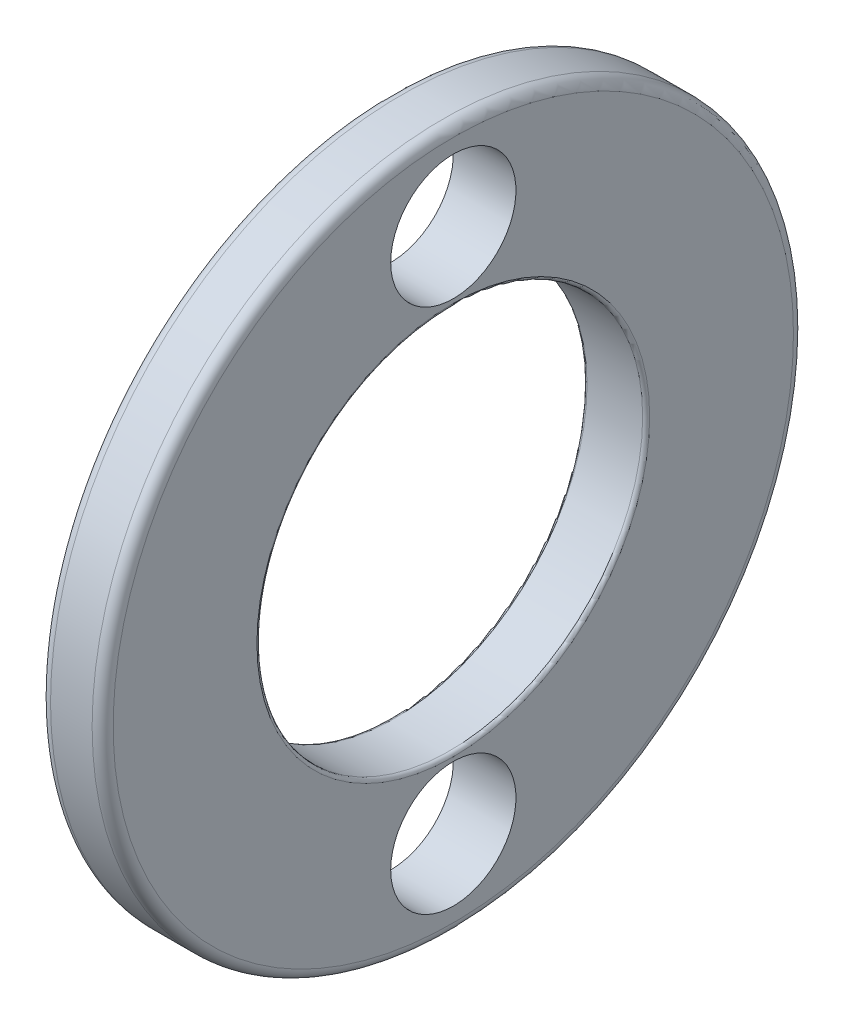
ISO-10303-21;
HEADER;
FILE_DESCRIPTION(('STEP AP214'),'2;1');
FILE_NAME('part.step','',(''),(''),'','','');
FILE_SCHEMA(('AUTOMOTIVE_DESIGN { 1 0 10303 214 1 1 1 1 }'));
ENDSEC;
DATA;
#1=APPLICATION_CONTEXT('core data for automotive mechanical design processes');
#2=APPLICATION_PROTOCOL_DEFINITION('international standard','automotive_design',2000,#1);
#3=PRODUCT_CONTEXT('',#1,'mechanical');
#4=PRODUCT('Part','Part','',(#3));
#5=PRODUCT_RELATED_PRODUCT_CATEGORY('part','',(#4));
#6=PRODUCT_DEFINITION_FORMATION('','',#4);
#7=PRODUCT_DEFINITION_CONTEXT('part definition',#1,'design');
#8=PRODUCT_DEFINITION('design','',#6,#7);
#9=PRODUCT_DEFINITION_SHAPE('','',#8);
#10=(LENGTH_UNIT() NAMED_UNIT(*) SI_UNIT(.MILLI.,.METRE.));
#11=(NAMED_UNIT(*) PLANE_ANGLE_UNIT() SI_UNIT($,.RADIAN.));
#12=(NAMED_UNIT(*) SI_UNIT($,.STERADIAN.) SOLID_ANGLE_UNIT());
#13=UNCERTAINTY_MEASURE_WITH_UNIT(LENGTH_MEASURE(1.E-05),#10,'distance_accuracy_value','');
#14=(GEOMETRIC_REPRESENTATION_CONTEXT(3) GLOBAL_UNCERTAINTY_ASSIGNED_CONTEXT((#13)) GLOBAL_UNIT_ASSIGNED_CONTEXT((#10,
#11,#12)) REPRESENTATION_CONTEXT('',''));
#15=CARTESIAN_POINT('',(0.,0.,0.));
#16=DIRECTION('',(0.,0.,1.));
#17=DIRECTION('',(1.,0.,0.));
#18=AXIS2_PLACEMENT_3D('',#15,#16,#17);
#19=CARTESIAN_POINT('',(5.214,19.4,0.));
#20=DIRECTION('',(-1.,0.,0.));
#21=DIRECTION('',(0.,0.,1.));
#22=AXIS2_PLACEMENT_3D('',#19,#20,#21);
#23=PLANE('',#22);
#24=CARTESIAN_POINT('',(5.214,15.,0.));
#25=DIRECTION('',(-1.,0.,0.));
#26=DIRECTION('',(0.,0.,1.));
#27=AXIS2_PLACEMENT_3D('',#24,#25,#26);
#28=CIRCLE('',#27,3.572);
#29=CARTESIAN_POINT('',(5.214,15.,3.572));
#30=VERTEX_POINT('',#29);
#31=EDGE_CURVE('E48',#30,#30,#28,.F.);
#32=ORIENTED_EDGE('',*,*,#31,.T.);
#33=EDGE_LOOP('',(#32));
#34=FACE_BOUND('',#33,.T.);
#35=CARTESIAN_POINT('',(5.214,0.,0.));
#36=DIRECTION('',(1.,0.,0.));
#37=DIRECTION('',(0.,0.,-1.));
#38=AXIS2_PLACEMENT_3D('',#35,#36,#37);
#39=CIRCLE('',#38,11.2);
#40=CARTESIAN_POINT('',(5.214,0.,-11.2));
#41=VERTEX_POINT('',#40);
#42=EDGE_CURVE('E38',#41,#41,#39,.T.);
#43=ORIENTED_EDGE('',*,*,#42,.T.);
#44=EDGE_LOOP('',(#43));
#45=FACE_BOUND('',#44,.T.);
#46=CARTESIAN_POINT('',(5.214,0.,0.));
#47=DIRECTION('',(1.,0.,0.));
#48=DIRECTION('',(0.,0.,-1.));
#49=AXIS2_PLACEMENT_3D('',#46,#47,#48);
#50=CIRCLE('',#49,19.4);
#51=CARTESIAN_POINT('',(5.214,0.,-19.4));
#52=VERTEX_POINT('',#51);
#53=EDGE_CURVE('E10',#52,#52,#50,.T.);
#54=ORIENTED_EDGE('',*,*,#53,.F.);
#55=EDGE_LOOP('',(#54));
#56=FACE_BOUND('',#55,.T.);
#57=CARTESIAN_POINT('',(5.214,-15.,0.));
#58=DIRECTION('',(-1.,0.,0.));
#59=DIRECTION('',(0.,0.,1.));
#60=AXIS2_PLACEMENT_3D('',#57,#58,#59);
#61=CIRCLE('',#60,3.572);
#62=CARTESIAN_POINT('',(5.214,-15.,3.572));
#63=VERTEX_POINT('',#62);
#64=EDGE_CURVE('E49',#63,#63,#61,.F.);
#65=ORIENTED_EDGE('',*,*,#64,.T.);
#66=EDGE_LOOP('',(#65));
#67=FACE_BOUND('',#66,.T.);
#68=ADVANCED_FACE('F30',(#34,#45,#56,#67),#23,.T.);
#69=CARTESIAN_POINT('',(8.786,11.2,0.));
#70=DIRECTION('',(1.,0.,0.));
#71=DIRECTION('',(0.,0.,-1.));
#72=AXIS2_PLACEMENT_3D('',#69,#70,#71);
#73=PLANE('',#72);
#74=CARTESIAN_POINT('',(8.786,15.,0.));
#75=DIRECTION('',(1.,0.,0.));
#76=DIRECTION('',(0.,0.,-1.));
#77=AXIS2_PLACEMENT_3D('',#74,#75,#76);
#78=CIRCLE('',#77,3.572);
#79=CARTESIAN_POINT('',(8.786,15.,3.572));
#80=VERTEX_POINT('',#79);
#81=EDGE_CURVE('E46',#80,#80,#78,.F.);
#82=ORIENTED_EDGE('',*,*,#81,.T.);
#83=EDGE_LOOP('',(#82));
#84=FACE_BOUND('',#83,.T.);
#85=CARTESIAN_POINT('',(8.786,0.,0.));
#86=DIRECTION('',(1.,0.,0.));
#87=DIRECTION('',(0.,0.,-1.));
#88=AXIS2_PLACEMENT_3D('',#85,#86,#87);
#89=CIRCLE('',#88,19.4);
#90=CARTESIAN_POINT('',(8.786,0.,-19.4));
#91=VERTEX_POINT('',#90);
#92=EDGE_CURVE('E66',#91,#91,#89,.T.);
#93=ORIENTED_EDGE('',*,*,#92,.T.);
#94=EDGE_LOOP('',(#93));
#95=FACE_BOUND('',#94,.T.);
#96=CARTESIAN_POINT('',(8.786,0.,0.));
#97=DIRECTION('',(1.,0.,0.));
#98=DIRECTION('',(0.,0.,-1.));
#99=AXIS2_PLACEMENT_3D('',#96,#97,#98);
#100=CIRCLE('',#99,11.2);
#101=CARTESIAN_POINT('',(8.786,0.,-11.2));
#102=VERTEX_POINT('',#101);
#103=EDGE_CURVE('E69',#102,#102,#100,.T.);
#104=ORIENTED_EDGE('',*,*,#103,.F.);
#105=EDGE_LOOP('',(#104));
#106=FACE_BOUND('',#105,.T.);
#107=CARTESIAN_POINT('',(8.786,-15.,0.));
#108=DIRECTION('',(1.,0.,0.));
#109=DIRECTION('',(0.,0.,-1.));
#110=AXIS2_PLACEMENT_3D('',#107,#108,#109);
#111=CIRCLE('',#110,3.572);
#112=CARTESIAN_POINT('',(8.786,-15.,3.572));
#113=VERTEX_POINT('',#112);
#114=EDGE_CURVE('E34',#113,#113,#111,.F.);
#115=ORIENTED_EDGE('',*,*,#114,.T.);
#116=EDGE_LOOP('',(#115));
#117=FACE_BOUND('',#116,.T.);
#118=ADVANCED_FACE('F94',(#84,#95,#106,#117),#73,.T.);
#119=CARTESIAN_POINT('',(5.81399999999993,0.,0.));
#120=DIRECTION('',(1.,0.,0.));
#121=DIRECTION('',(0.,0.,-1.));
#122=AXIS2_PLACEMENT_3D('',#119,#120,#121);
#123=TOROIDAL_SURFACE('',#122,19.4000000000001,0.599999999999927);
#124=ORIENTED_EDGE('',*,*,#53,.T.);
#125=EDGE_LOOP('',(#124));
#126=FACE_BOUND('',#125,.T.);
#127=CARTESIAN_POINT('',(5.814,0.,0.));
#128=DIRECTION('',(1.,0.,0.));
#129=DIRECTION('',(0.,0.,-1.));
#130=AXIS2_PLACEMENT_3D('',#127,#128,#129);
#131=CIRCLE('',#130,20.);
#132=CARTESIAN_POINT('',(5.814,0.,-20.));
#133=VERTEX_POINT('',#132);
#134=EDGE_CURVE('E53',#133,#133,#131,.T.);
#135=ORIENTED_EDGE('',*,*,#134,.F.);
#136=EDGE_LOOP('',(#135));
#137=FACE_BOUND('',#136,.T.);
#138=ADVANCED_FACE('F32',(#126,#137),#123,.T.);
#139=CARTESIAN_POINT('',(5.41400000000055,0.,0.));
#140=DIRECTION('',(1.,0.,0.));
#141=DIRECTION('',(0.,0.,-1.));
#142=AXIS2_PLACEMENT_3D('',#139,#140,#141);
#143=TOROIDAL_SURFACE('',#142,11.2000000000005,0.200000000000551);
#144=CARTESIAN_POINT('',(5.414,0.,0.));
#145=DIRECTION('',(1.,0.,0.));
#146=DIRECTION('',(0.,0.,-1.));
#147=AXIS2_PLACEMENT_3D('',#144,#145,#146);
#148=CIRCLE('',#147,11.);
#149=CARTESIAN_POINT('',(5.414,0.,-11.));
#150=VERTEX_POINT('',#149);
#151=EDGE_CURVE('E43',#150,#150,#148,.T.);
#152=ORIENTED_EDGE('',*,*,#151,.T.);
#153=EDGE_LOOP('',(#152));
#154=FACE_BOUND('',#153,.T.);
#155=ORIENTED_EDGE('',*,*,#42,.F.);
#156=EDGE_LOOP('',(#155));
#157=FACE_BOUND('',#156,.T.);
#158=ADVANCED_FACE('F77',(#154,#157),#143,.T.);
#159=CARTESIAN_POINT('',(50.,0.,0.));
#160=DIRECTION('',(1.,0.,0.));
#161=DIRECTION('',(0.,0.,-1.));
#162=AXIS2_PLACEMENT_3D('',#159,#160,#161);
#163=CYLINDRICAL_SURFACE('',#162,11.);
#164=CARTESIAN_POINT('',(8.586,0.,0.));
#165=DIRECTION('',(1.,0.,0.));
#166=DIRECTION('',(0.,0.,-1.));
#167=AXIS2_PLACEMENT_3D('',#164,#165,#166);
#168=CIRCLE('',#167,11.);
#169=CARTESIAN_POINT('',(8.586,0.,-11.));
#170=VERTEX_POINT('',#169);
#171=EDGE_CURVE('E72',#170,#170,#168,.T.);
#172=ORIENTED_EDGE('',*,*,#171,.T.);
#173=EDGE_LOOP('',(#172));
#174=FACE_BOUND('',#173,.T.);
#175=ORIENTED_EDGE('',*,*,#151,.F.);
#176=EDGE_LOOP('',(#175));
#177=FACE_BOUND('',#176,.T.);
#178=ADVANCED_FACE('F80',(#174,#177),#163,.F.);
#179=CARTESIAN_POINT('',(8.58599999999945,0.,0.));
#180=DIRECTION('',(1.,0.,0.));
#181=DIRECTION('',(0.,0.,-1.));
#182=AXIS2_PLACEMENT_3D('',#179,#180,#181);
#183=TOROIDAL_SURFACE('',#182,11.2000000000005,0.200000000000548);
#184=ORIENTED_EDGE('',*,*,#103,.T.);
#185=EDGE_LOOP('',(#184));
#186=FACE_BOUND('',#185,.T.);
#187=ORIENTED_EDGE('',*,*,#171,.F.);
#188=EDGE_LOOP('',(#187));
#189=FACE_BOUND('',#188,.T.);
#190=ADVANCED_FACE('F82',(#186,#189),#183,.T.);
#191=CARTESIAN_POINT('',(8.18600000000007,0.,0.));
#192=DIRECTION('',(1.,0.,0.));
#193=DIRECTION('',(0.,0.,-1.));
#194=AXIS2_PLACEMENT_3D('',#191,#192,#193);
#195=TOROIDAL_SURFACE('',#194,19.4000000000001,0.599999999999928);
#196=CARTESIAN_POINT('',(8.186,0.,0.));
#197=DIRECTION('',(1.,0.,0.));
#198=DIRECTION('',(0.,0.,-1.));
#199=AXIS2_PLACEMENT_3D('',#196,#197,#198);
#200=CIRCLE('',#199,20.);
#201=CARTESIAN_POINT('',(8.186,0.,-20.));
#202=VERTEX_POINT('',#201);
#203=EDGE_CURVE('E63',#202,#202,#200,.T.);
#204=ORIENTED_EDGE('',*,*,#203,.T.);
#205=EDGE_LOOP('',(#204));
#206=FACE_BOUND('',#205,.T.);
#207=ORIENTED_EDGE('',*,*,#92,.F.);
#208=EDGE_LOOP('',(#207));
#209=FACE_BOUND('',#208,.T.);
#210=ADVANCED_FACE('F89',(#206,#209),#195,.T.);
#211=CARTESIAN_POINT('',(50.,0.,0.));
#212=DIRECTION('',(1.,0.,0.));
#213=DIRECTION('',(0.,0.,-1.));
#214=AXIS2_PLACEMENT_3D('',#211,#212,#213);
#215=CYLINDRICAL_SURFACE('',#214,20.);
#216=ORIENTED_EDGE('',*,*,#134,.T.);
#217=EDGE_LOOP('',(#216));
#218=FACE_BOUND('',#217,.T.);
#219=ORIENTED_EDGE('',*,*,#203,.F.);
#220=EDGE_LOOP('',(#219));
#221=FACE_BOUND('',#220,.T.);
#222=ADVANCED_FACE('F109',(#218,#221),#215,.T.);
#223=CARTESIAN_POINT('',(12.358,15.,0.));
#224=DIRECTION('',(-1.,0.,0.));
#225=DIRECTION('',(0.,0.,1.));
#226=AXIS2_PLACEMENT_3D('',#223,#224,#225);
#227=CYLINDRICAL_SURFACE('',#226,3.572);
#228=CARTESIAN_POINT('',(5.214,15.,3.572));
#229=CARTESIAN_POINT('',(5.25120833333333,15.,3.572));
#230=CARTESIAN_POINT('',(5.28841666666667,15.,3.572));
#231=CARTESIAN_POINT('',(5.36283333333333,15.,3.572));
#232=CARTESIAN_POINT('',(5.40004166666667,15.,3.572));
#233=CARTESIAN_POINT('',(5.47445833333333,15.,3.572));
#234=CARTESIAN_POINT('',(5.51166666666667,15.,3.572));
#235=CARTESIAN_POINT('',(5.58608333333333,15.,3.572));
#236=CARTESIAN_POINT('',(5.62329166666667,15.,3.572));
#237=CARTESIAN_POINT('',(5.69770833333333,15.,3.572));
#238=CARTESIAN_POINT('',(5.73491666666667,15.,3.572));
#239=CARTESIAN_POINT('',(5.80933333333333,15.,3.572));
#240=CARTESIAN_POINT('',(5.84654166666667,15.,3.572));
#241=CARTESIAN_POINT('',(5.92095833333333,15.,3.572));
#242=CARTESIAN_POINT('',(5.95816666666667,15.,3.572));
#243=CARTESIAN_POINT('',(6.03258333333333,15.,3.572));
#244=CARTESIAN_POINT('',(6.06979166666667,15.,3.572));
#245=CARTESIAN_POINT('',(6.14420833333333,15.,3.572));
#246=CARTESIAN_POINT('',(6.18141666666667,15.,3.572));
#247=CARTESIAN_POINT('',(6.25583333333333,15.,3.572));
#248=CARTESIAN_POINT('',(6.29304166666667,15.,3.572));
#249=CARTESIAN_POINT('',(6.36745833333333,15.,3.572));
#250=CARTESIAN_POINT('',(6.40466666666667,15.,3.572));
#251=CARTESIAN_POINT('',(6.47908333333333,15.,3.572));
#252=CARTESIAN_POINT('',(6.51629166666667,15.,3.572));
#253=CARTESIAN_POINT('',(6.59070833333333,15.,3.572));
#254=CARTESIAN_POINT('',(6.62791666666667,15.,3.572));
#255=CARTESIAN_POINT('',(6.70233333333333,15.,3.572));
#256=CARTESIAN_POINT('',(6.73954166666667,15.,3.572));
#257=CARTESIAN_POINT('',(6.81395833333333,15.,3.572));
#258=CARTESIAN_POINT('',(6.85116666666667,15.,3.572));
#259=CARTESIAN_POINT('',(6.92558333333333,15.,3.572));
#260=CARTESIAN_POINT('',(6.96279166666667,15.,3.572));
#261=CARTESIAN_POINT('',(7.03720833333333,15.,3.572));
#262=CARTESIAN_POINT('',(7.07441666666667,15.,3.572));
#263=CARTESIAN_POINT('',(7.14883333333333,15.,3.572));
#264=CARTESIAN_POINT('',(7.18604166666667,15.,3.572));
#265=CARTESIAN_POINT('',(7.26045833333333,15.,3.572));
#266=CARTESIAN_POINT('',(7.29766666666667,15.,3.572));
#267=CARTESIAN_POINT('',(7.37208333333333,15.,3.572));
#268=CARTESIAN_POINT('',(7.40929166666667,15.,3.572));
#269=CARTESIAN_POINT('',(7.48370833333333,15.,3.572));
#270=CARTESIAN_POINT('',(7.52091666666667,15.,3.572));
#271=CARTESIAN_POINT('',(7.59533333333333,15.,3.572));
#272=CARTESIAN_POINT('',(7.63254166666666,15.,3.572));
#273=CARTESIAN_POINT('',(7.70695833333333,15.,3.572));
#274=CARTESIAN_POINT('',(7.74416666666667,15.,3.572));
#275=CARTESIAN_POINT('',(7.81858333333333,15.,3.572));
#276=CARTESIAN_POINT('',(7.85579166666667,15.,3.572));
#277=CARTESIAN_POINT('',(7.93020833333333,15.,3.572));
#278=CARTESIAN_POINT('',(7.96741666666666,15.,3.572));
#279=CARTESIAN_POINT('',(8.04183333333333,15.,3.572));
#280=CARTESIAN_POINT('',(8.07904166666667,15.,3.572));
#281=CARTESIAN_POINT('',(8.15345833333333,15.,3.572));
#282=CARTESIAN_POINT('',(8.19066666666667,15.,3.572));
#283=CARTESIAN_POINT('',(8.26508333333333,15.,3.572));
#284=CARTESIAN_POINT('',(8.30229166666667,15.,3.572));
#285=CARTESIAN_POINT('',(8.37670833333333,15.,3.572));
#286=CARTESIAN_POINT('',(8.41391666666666,15.,3.572));
#287=CARTESIAN_POINT('',(8.48833333333333,15.,3.572));
#288=CARTESIAN_POINT('',(8.52554166666666,15.,3.572));
#289=CARTESIAN_POINT('',(8.59995833333333,15.,3.572));
#290=CARTESIAN_POINT('',(8.63716666666666,15.,3.572));
#291=CARTESIAN_POINT('',(8.71158333333333,15.,3.572));
#292=CARTESIAN_POINT('',(8.74879166666666,15.,3.572));
#293=CARTESIAN_POINT('',(8.786,15.,3.572));
#294=B_SPLINE_CURVE_WITH_KNOTS('',3,(#228,#229,#230,#231,#232,#233,#234,#235,#236,#237,#238,
#239,#240,#241,#242,#243,#244,#245,#246,#247,#248,#249,#250,#251,#252,#253,#254,#255,#256,#257,
#258,#259,#260,#261,#262,#263,#264,#265,#266,#267,#268,#269,#270,#271,#272,#273,#274,#275,#276,
#277,#278,#279,#280,#281,#282,#283,#284,#285,#286,#287,#288,#289,#290,#291,#292,#293),
.UNSPECIFIED.,.F.,.F.,(4,2,2,2,2,2,2,2,2,2,2,2,2,2,2,2,2,2,2,2,2,2,2,2,2,2,2,2,2,2,2,2,4),(0.,
0.111625,0.22325,0.334875,0.4465,0.558125,0.669749999999999,0.781374999999999,0.893,1.004625,
1.11625,1.227875,1.3395,1.451125,1.56275,1.674375,1.786,1.897625,2.00925,2.120875,2.2325,
2.344125,2.45575,2.567375,2.679,2.790625,2.90225,3.013875,3.1255,3.237125,3.34875,3.460375,
3.572),.UNSPECIFIED.);
#295=EDGE_CURVE('BSEAM105',#30,#80,#294,.T.);
#296=ORIENTED_EDGE('',*,*,#31,.F.);
#297=ORIENTED_EDGE('',*,*,#81,.F.);
#298=ORIENTED_EDGE('',*,*,#295,.T.);
#299=ORIENTED_EDGE('',*,*,#295,.F.);
#300=EDGE_LOOP('',(#296,#298,#297,#299));
#301=FACE_BOUND('',#300,.T.);
#302=ADVANCED_FACE('F105',(#301),#227,.F.);
#303=CARTESIAN_POINT('',(12.358,-15.,0.));
#304=DIRECTION('',(-1.,0.,0.));
#305=DIRECTION('',(0.,0.,1.));
#306=AXIS2_PLACEMENT_3D('',#303,#304,#305);
#307=CYLINDRICAL_SURFACE('',#306,3.572);
#308=CARTESIAN_POINT('',(5.214,-15.,3.572));
#309=CARTESIAN_POINT('',(5.25120833333333,-15.,3.572));
#310=CARTESIAN_POINT('',(5.28841666666667,-15.,3.572));
#311=CARTESIAN_POINT('',(5.36283333333333,-15.,3.572));
#312=CARTESIAN_POINT('',(5.40004166666667,-15.,3.572));
#313=CARTESIAN_POINT('',(5.47445833333333,-15.,3.572));
#314=CARTESIAN_POINT('',(5.51166666666667,-15.,3.572));
#315=CARTESIAN_POINT('',(5.58608333333333,-15.,3.572));
#316=CARTESIAN_POINT('',(5.62329166666667,-15.,3.572));
#317=CARTESIAN_POINT('',(5.69770833333333,-15.,3.572));
#318=CARTESIAN_POINT('',(5.73491666666667,-15.,3.572));
#319=CARTESIAN_POINT('',(5.80933333333333,-15.,3.572));
#320=CARTESIAN_POINT('',(5.84654166666667,-15.,3.572));
#321=CARTESIAN_POINT('',(5.92095833333333,-15.,3.572));
#322=CARTESIAN_POINT('',(5.95816666666667,-15.,3.572));
#323=CARTESIAN_POINT('',(6.03258333333333,-15.,3.572));
#324=CARTESIAN_POINT('',(6.06979166666667,-15.,3.572));
#325=CARTESIAN_POINT('',(6.14420833333333,-15.,3.572));
#326=CARTESIAN_POINT('',(6.18141666666667,-15.,3.572));
#327=CARTESIAN_POINT('',(6.25583333333333,-15.,3.572));
#328=CARTESIAN_POINT('',(6.29304166666667,-15.,3.572));
#329=CARTESIAN_POINT('',(6.36745833333333,-15.,3.572));
#330=CARTESIAN_POINT('',(6.40466666666667,-15.,3.572));
#331=CARTESIAN_POINT('',(6.47908333333333,-15.,3.572));
#332=CARTESIAN_POINT('',(6.51629166666667,-15.,3.572));
#333=CARTESIAN_POINT('',(6.59070833333333,-15.,3.572));
#334=CARTESIAN_POINT('',(6.62791666666667,-15.,3.572));
#335=CARTESIAN_POINT('',(6.70233333333333,-15.,3.572));
#336=CARTESIAN_POINT('',(6.73954166666667,-15.,3.572));
#337=CARTESIAN_POINT('',(6.81395833333333,-15.,3.572));
#338=CARTESIAN_POINT('',(6.85116666666667,-15.,3.572));
#339=CARTESIAN_POINT('',(6.92558333333333,-15.,3.572));
#340=CARTESIAN_POINT('',(6.96279166666667,-15.,3.572));
#341=CARTESIAN_POINT('',(7.03720833333333,-15.,3.572));
#342=CARTESIAN_POINT('',(7.07441666666667,-15.,3.572));
#343=CARTESIAN_POINT('',(7.14883333333333,-15.,3.572));
#344=CARTESIAN_POINT('',(7.18604166666667,-15.,3.572));
#345=CARTESIAN_POINT('',(7.26045833333333,-15.,3.572));
#346=CARTESIAN_POINT('',(7.29766666666667,-15.,3.572));
#347=CARTESIAN_POINT('',(7.37208333333333,-15.,3.572));
#348=CARTESIAN_POINT('',(7.40929166666667,-15.,3.572));
#349=CARTESIAN_POINT('',(7.48370833333333,-15.,3.572));
#350=CARTESIAN_POINT('',(7.52091666666667,-15.,3.572));
#351=CARTESIAN_POINT('',(7.59533333333333,-15.,3.572));
#352=CARTESIAN_POINT('',(7.63254166666666,-15.,3.572));
#353=CARTESIAN_POINT('',(7.70695833333333,-15.,3.572));
#354=CARTESIAN_POINT('',(7.74416666666667,-15.,3.572));
#355=CARTESIAN_POINT('',(7.81858333333333,-15.,3.572));
#356=CARTESIAN_POINT('',(7.85579166666667,-15.,3.572));
#357=CARTESIAN_POINT('',(7.93020833333333,-15.,3.572));
#358=CARTESIAN_POINT('',(7.96741666666666,-15.,3.572));
#359=CARTESIAN_POINT('',(8.04183333333333,-15.,3.572));
#360=CARTESIAN_POINT('',(8.07904166666667,-15.,3.572));
#361=CARTESIAN_POINT('',(8.15345833333333,-15.,3.572));
#362=CARTESIAN_POINT('',(8.19066666666667,-15.,3.572));
#363=CARTESIAN_POINT('',(8.26508333333333,-15.,3.572));
#364=CARTESIAN_POINT('',(8.30229166666667,-15.,3.572));
#365=CARTESIAN_POINT('',(8.37670833333333,-15.,3.572));
#366=CARTESIAN_POINT('',(8.41391666666666,-15.,3.572));
#367=CARTESIAN_POINT('',(8.48833333333333,-15.,3.572));
#368=CARTESIAN_POINT('',(8.52554166666666,-15.,3.572));
#369=CARTESIAN_POINT('',(8.59995833333333,-15.,3.572));
#370=CARTESIAN_POINT('',(8.63716666666666,-15.,3.572));
#371=CARTESIAN_POINT('',(8.71158333333333,-15.,3.572));
#372=CARTESIAN_POINT('',(8.74879166666666,-15.,3.572));
#373=CARTESIAN_POINT('',(8.786,-15.,3.572));
#374=B_SPLINE_CURVE_WITH_KNOTS('',3,(#308,#309,#310,#311,#312,#313,#314,#315,#316,#317,#318,
#319,#320,#321,#322,#323,#324,#325,#326,#327,#328,#329,#330,#331,#332,#333,#334,#335,#336,#337,
#338,#339,#340,#341,#342,#343,#344,#345,#346,#347,#348,#349,#350,#351,#352,#353,#354,#355,#356,
#357,#358,#359,#360,#361,#362,#363,#364,#365,#366,#367,#368,#369,#370,#371,#372,#373),
.UNSPECIFIED.,.F.,.F.,(4,2,2,2,2,2,2,2,2,2,2,2,2,2,2,2,2,2,2,2,2,2,2,2,2,2,2,2,2,2,2,2,4),(0.,
0.111625,0.22325,0.334875,0.4465,0.558125,0.669749999999999,0.781374999999999,0.893,1.004625,
1.11625,1.227875,1.3395,1.451125,1.56275,1.674375,1.786,1.897625,2.00925,2.120875,2.2325,
2.344125,2.45575,2.567375,2.679,2.790625,2.90225,3.013875,3.1255,3.237125,3.34875,3.460375,
3.572),.UNSPECIFIED.);
#375=EDGE_CURVE('BSEAM108',#63,#113,#374,.T.);
#376=ORIENTED_EDGE('',*,*,#64,.F.);
#377=ORIENTED_EDGE('',*,*,#114,.F.);
#378=ORIENTED_EDGE('',*,*,#375,.T.);
#379=ORIENTED_EDGE('',*,*,#375,.F.);
#380=EDGE_LOOP('',(#376,#378,#377,#379));
#381=FACE_BOUND('',#380,.T.);
#382=ADVANCED_FACE('F108',(#381),#307,.F.);
#383=CLOSED_SHELL('',(#68,#118,#138,#158,#178,#190,#210,#222,#302,#382));
#384=MANIFOLD_SOLID_BREP('B2',#383);
#385=ADVANCED_BREP_SHAPE_REPRESENTATION('',(#18,#384),#14);
#386=SHAPE_DEFINITION_REPRESENTATION(#9,#385);
ENDSEC;
END-ISO-10303-21;
